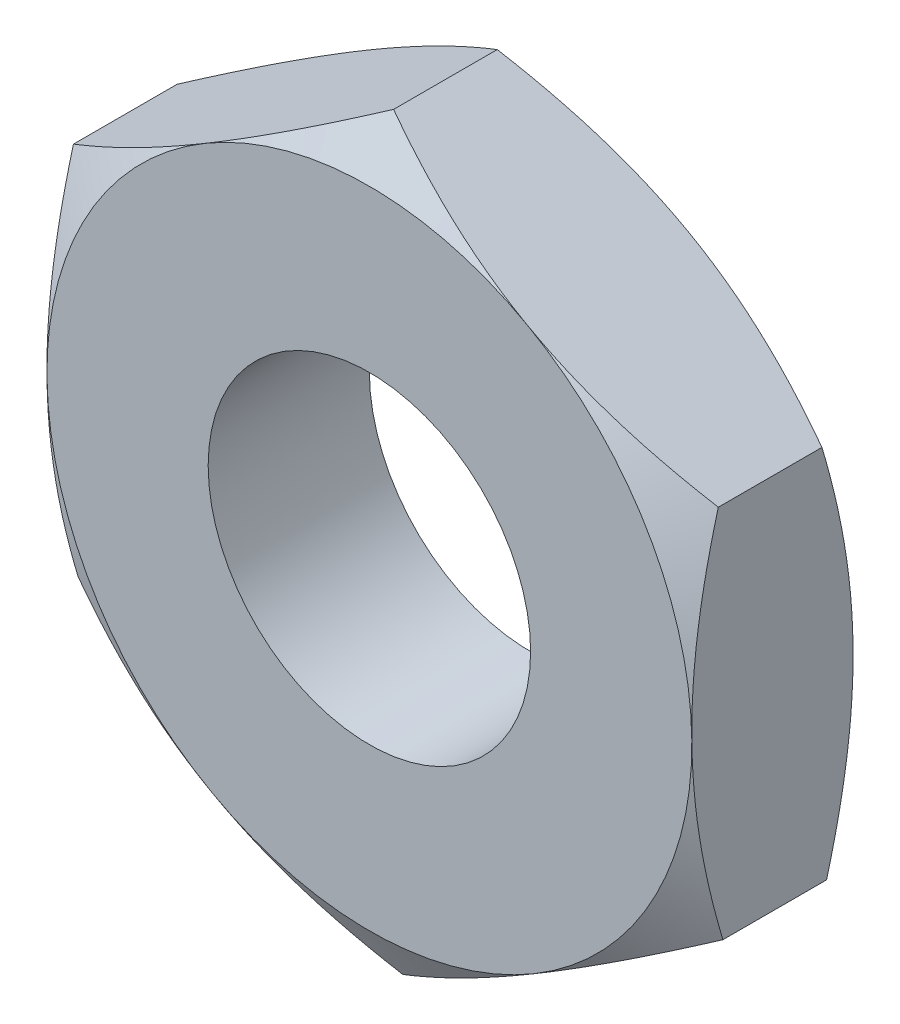
ISO-10303-21;
HEADER;
FILE_DESCRIPTION(('STEP AP214'),'2;1');
FILE_NAME('part.step','',(''),(''),'','','');
FILE_SCHEMA(('AUTOMOTIVE_DESIGN { 1 0 10303 214 1 1 1 1 }'));
ENDSEC;
DATA;
#1=APPLICATION_CONTEXT('core data for automotive mechanical design processes');
#2=APPLICATION_PROTOCOL_DEFINITION('international standard','automotive_design',2000,#1);
#3=PRODUCT_CONTEXT('',#1,'mechanical');
#4=PRODUCT('Part','Part','',(#3));
#5=PRODUCT_RELATED_PRODUCT_CATEGORY('part','',(#4));
#6=PRODUCT_DEFINITION_FORMATION('','',#4);
#7=PRODUCT_DEFINITION_CONTEXT('part definition',#1,'design');
#8=PRODUCT_DEFINITION('design','',#6,#7);
#9=PRODUCT_DEFINITION_SHAPE('','',#8);
#10=(LENGTH_UNIT() NAMED_UNIT(*) SI_UNIT(.MILLI.,.METRE.));
#11=(NAMED_UNIT(*) PLANE_ANGLE_UNIT() SI_UNIT($,.RADIAN.));
#12=(NAMED_UNIT(*) SI_UNIT($,.STERADIAN.) SOLID_ANGLE_UNIT());
#13=UNCERTAINTY_MEASURE_WITH_UNIT(LENGTH_MEASURE(1.E-05),#10,'distance_accuracy_value','');
#14=(GEOMETRIC_REPRESENTATION_CONTEXT(3) GLOBAL_UNCERTAINTY_ASSIGNED_CONTEXT((#13)) GLOBAL_UNIT_ASSIGNED_CONTEXT((#10,
#11,#12)) REPRESENTATION_CONTEXT('',''));
#15=CARTESIAN_POINT('',(0.,0.,0.));
#16=DIRECTION('',(0.,0.,1.));
#17=DIRECTION('',(1.,0.,0.));
#18=AXIS2_PLACEMENT_3D('',#15,#16,#17);
#19=CARTESIAN_POINT('',(0.,0.,-2.5));
#20=DIRECTION('',(0.,0.,1.));
#21=DIRECTION('',(1.,0.,0.));
#22=AXIS2_PLACEMENT_3D('',#19,#20,#21);
#23=PLANE('',#22);
#24=CARTESIAN_POINT('',(0.,0.,-2.5));
#25=DIRECTION('',(0.,0.,1.));
#26=DIRECTION('',(1.,0.,0.));
#27=AXIS2_PLACEMENT_3D('',#24,#25,#26);
#28=CIRCLE('',#27,5.);
#29=CARTESIAN_POINT('',(5.,0.,-2.5));
#30=VERTEX_POINT('',#29);
#31=EDGE_CURVE('E280',#30,#30,#28,.T.);
#32=ORIENTED_EDGE('',*,*,#31,.T.);
#33=EDGE_LOOP('',(#32));
#34=FACE_BOUND('',#33,.T.);
#35=CARTESIAN_POINT('',(0.,0.,-2.5));
#36=DIRECTION('',(0.,0.,1.));
#37=DIRECTION('',(1.,0.,0.));
#38=AXIS2_PLACEMENT_3D('',#35,#36,#37);
#39=CIRCLE('',#38,10.);
#40=CARTESIAN_POINT('',(9.99924389690009,0.122969469000651,-2.5));
#41=VERTEX_POINT('',#40);
#42=CARTESIAN_POINT('',(5.1061166324945,-8.59811449885165,-2.5));
#43=VERTEX_POINT('',#42);
#44=EDGE_CURVE('E50',#41,#43,#39,.F.);
#45=ORIENTED_EDGE('',*,*,#44,.T.);
#46=CARTESIAN_POINT('',(-4.89312726440558,-8.72108396785232,-2.5));
#47=VERTEX_POINT('',#46);
#48=EDGE_CURVE('E12',#43,#47,#39,.F.);
#49=ORIENTED_EDGE('',*,*,#48,.T.);
#50=CARTESIAN_POINT('',(-9.99924389690009,-0.122969469000663,-2.5));
#51=VERTEX_POINT('',#50);
#52=EDGE_CURVE('E56',#47,#51,#39,.F.);
#53=ORIENTED_EDGE('',*,*,#52,.T.);
#54=CARTESIAN_POINT('',(-5.1061166324945,8.59811449885165,-2.5));
#55=VERTEX_POINT('',#54);
#56=EDGE_CURVE('E411',#51,#55,#39,.F.);
#57=ORIENTED_EDGE('',*,*,#56,.T.);
#58=CARTESIAN_POINT('',(4.89312726440559,8.72108396785231,-2.5));
#59=VERTEX_POINT('',#58);
#60=EDGE_CURVE('E156',#55,#59,#39,.F.);
#61=ORIENTED_EDGE('',*,*,#60,.T.);
#62=CARTESIAN_POINT('',(0.,0.,-2.5));
#63=DIRECTION('',(0.,0.,1.));
#64=DIRECTION('',(1.,0.,0.));
#65=AXIS2_PLACEMENT_3D('',#62,#63,#64);
#66=CIRCLE('',#65,10.);
#67=EDGE_CURVE('E138',#41,#59,#66,.T.);
#68=ORIENTED_EDGE('',*,*,#67,.F.);
#69=EDGE_LOOP('',(#45,#49,#53,#57,#61,#68));
#70=FACE_BOUND('',#69,.T.);
#71=ADVANCED_FACE('F45',(#34,#70),#23,.F.);
#72=CARTESIAN_POINT('',(0.,0.,2.5));
#73=DIRECTION('',(0.,0.,1.));
#74=DIRECTION('',(1.,0.,0.));
#75=AXIS2_PLACEMENT_3D('',#72,#73,#74);
#76=PLANE('',#75);
#77=CARTESIAN_POINT('',(0.,0.,2.5));
#78=DIRECTION('',(0.,0.,1.));
#79=DIRECTION('',(1.,0.,0.));
#80=AXIS2_PLACEMENT_3D('',#77,#78,#79);
#81=CIRCLE('',#80,5.);
#82=CARTESIAN_POINT('',(5.,0.,2.5));
#83=VERTEX_POINT('',#82);
#84=EDGE_CURVE('E275',#83,#83,#81,.T.);
#85=ORIENTED_EDGE('',*,*,#84,.F.);
#86=EDGE_LOOP('',(#85));
#87=FACE_BOUND('',#86,.T.);
#88=CARTESIAN_POINT('',(0.,0.,2.5));
#89=DIRECTION('',(0.,0.,1.));
#90=DIRECTION('',(1.,0.,0.));
#91=AXIS2_PLACEMENT_3D('',#88,#89,#90);
#92=CIRCLE('',#91,10.);
#93=CARTESIAN_POINT('',(5.1061166324945,-8.59811449885165,2.5));
#94=VERTEX_POINT('',#93);
#95=CARTESIAN_POINT('',(9.99924389690009,0.122969469000651,2.5));
#96=VERTEX_POINT('',#95);
#97=EDGE_CURVE('E337',#94,#96,#92,.T.);
#98=ORIENTED_EDGE('',*,*,#97,.T.);
#99=CARTESIAN_POINT('',(4.89312726440559,8.72108396785232,2.5));
#100=VERTEX_POINT('',#99);
#101=EDGE_CURVE('E340',#96,#100,#92,.T.);
#102=ORIENTED_EDGE('',*,*,#101,.T.);
#103=CARTESIAN_POINT('',(-5.1061166324945,8.59811449885166,2.5));
#104=VERTEX_POINT('',#103);
#105=EDGE_CURVE('E352',#100,#104,#92,.T.);
#106=ORIENTED_EDGE('',*,*,#105,.T.);
#107=CARTESIAN_POINT('',(-9.9992438969001,-0.122969469000663,2.5));
#108=VERTEX_POINT('',#107);
#109=EDGE_CURVE('E355',#104,#108,#92,.T.);
#110=ORIENTED_EDGE('',*,*,#109,.T.);
#111=CARTESIAN_POINT('',(-4.89312726440558,-8.72108396785232,2.5));
#112=VERTEX_POINT('',#111);
#113=EDGE_CURVE('E350',#108,#112,#92,.T.);
#114=ORIENTED_EDGE('',*,*,#113,.T.);
#115=EDGE_CURVE('E343',#112,#94,#92,.T.);
#116=ORIENTED_EDGE('',*,*,#115,.T.);
#117=EDGE_LOOP('',(#98,#102,#106,#110,#114,#116));
#118=FACE_BOUND('',#117,.T.);
#119=ADVANCED_FACE('F318',(#87,#118),#76,.T.);
#120=CARTESIAN_POINT('',(0.14199291205927,-11.546132311136,2.5));
#121=DIRECTION('',(-0.51061166324945,0.859811449885165,0.));
#122=DIRECTION('',(-0.859811449885165,-0.51061166324945,0.));
#123=AXIS2_PLACEMENT_3D('',#120,#121,#122);
#124=PLANE('',#123);
#125=DIRECTION('',(0.,0.,-1.));
#126=VECTOR('',#125,1.);
#127=CARTESIAN_POINT('',(0.14199291205927,-11.546132311136,2.5));
#128=LINE('',#127,#126);
#129=CARTESIAN_POINT('',(0.141992912059271,-11.546132311136,1.6068360252296));
#130=VERTEX_POINT('',#129);
#131=CARTESIAN_POINT('',(0.14199291205927,-11.546132311136,-1.6068360252296));
#132=VERTEX_POINT('',#131);
#133=EDGE_CURVE('E279',#130,#132,#128,.T.);
#134=ORIENTED_EDGE('',*,*,#133,.T.);
#135=CARTESIAN_POINT('',(0.14179291205927,-11.5462510840747,-1.60676887574095));
#136=CARTESIAN_POINT('',(0.36003742235635,-11.4166433748348,-1.68003086041392));
#137=CARTESIAN_POINT('',(0.579095662103258,-11.2865524204045,-1.74996771347809));
#138=CARTESIAN_POINT('',(1.01896882595015,-11.0253272787288,-1.88226853206774));
#139=CARTESIAN_POINT('',(1.23978430252224,-10.8941927633897,-1.94463000688557));
#140=CARTESIAN_POINT('',(1.9057887366652,-10.4986762441637,-2.1191445193077));
#141=CARTESIAN_POINT('',(2.35360683563148,-10.2327328860275,-2.2184075331083));
#142=CARTESIAN_POINT('',(3.02374611913412,-9.83476082575339,-2.33480262222604));
#143=CARTESIAN_POINT('',(3.24406521952897,-9.70392109070071,-2.36795919843691));
#144=CARTESIAN_POINT('',(3.68572348225829,-9.44163584182411,-2.42356063306236));
#145=CARTESIAN_POINT('',(3.90706266414321,-9.31019031638987,-2.44600528530741));
#146=CARTESIAN_POINT('',(4.35011023453883,-9.04708000674169,-2.47960778554735));
#147=CARTESIAN_POINT('',(4.57181786921312,-8.91541567020458,-2.49077904611686));
#148=CARTESIAN_POINT('',(5.01543792483326,-8.65196538179394,-2.50159738523386));
#149=CARTESIAN_POINT('',(5.23735033924013,-8.52017943380369,-2.5012448198362));
#150=CARTESIAN_POINT('',(5.65222047980425,-8.27380270488914,-2.48981722704964));
#151=CARTESIAN_POINT('',(5.84520748853103,-8.15919453408067,-2.48013622464735));
#152=CARTESIAN_POINT('',(6.23073014979142,-7.9302462369711,-2.45224656286571));
#153=CARTESIAN_POINT('',(6.42326576942857,-7.81590613020604,-2.43403730025691));
#154=CARTESIAN_POINT('',(7.00012659590867,-7.47332885223214,-2.36704763292972));
#155=CARTESIAN_POINT('',(7.3834307196231,-7.24569806624256,-2.30591369487541));
#156=CARTESIAN_POINT('',(8.15410487919466,-6.78802189259453,-2.15307836950258));
#157=CARTESIAN_POINT('',(8.54137656113389,-6.5580349138554,-2.06072913904862));
#158=CARTESIAN_POINT('',(9.3101448030815,-6.10149059739317,-1.85113476781712));
#159=CARTESIAN_POINT('',(9.69165120727897,-5.87492741355373,-1.73393885312451));
#160=CARTESIAN_POINT('',(10.0704403529297,-5.6499779136286,-1.60676887574095));
#161=B_SPLINE_CURVE_WITH_KNOTS('',3,(#135,#136,#137,#138,#139,#140,#141,#142,#143,#144,#145,
#146,#147,#148,#149,#150,#151,#152,#153,#154,#155,#156,#157,#158,#159,#160),.UNSPECIFIED.,.F.,
.F.,(4,2,2,2,2,2,2,2,2,2,2,2,4),(0.,0.792505434166329,1.58527073485053,3.17417612487573,
3.94912807894729,4.72409494770965,5.49813870481568,6.27215854609879,6.94597477369979,
7.61983866954597,8.96852405205878,10.3471199887695,11.7230097658181),.UNSPECIFIED.);
#162=EDGE_CURVE('E65',#132,#43,#161,.T.);
#163=ORIENTED_EDGE('',*,*,#162,.T.);
#164=CARTESIAN_POINT('',(10.0702403529297,-5.65009668656732,-1.6068360252296));
#165=VERTEX_POINT('',#164);
#166=EDGE_CURVE('E153',#43,#165,#161,.T.);
#167=ORIENTED_EDGE('',*,*,#166,.T.);
#168=DIRECTION('',(0.,0.,-1.));
#169=VECTOR('',#168,1.);
#170=CARTESIAN_POINT('',(10.0702403529297,-5.65009668656732,2.5));
#171=LINE('',#170,#169);
#172=CARTESIAN_POINT('',(10.0702403529297,-5.65009668656732,1.6068360252296));
#173=VERTEX_POINT('',#172);
#174=EDGE_CURVE('E167',#173,#165,#171,.T.);
#175=ORIENTED_EDGE('',*,*,#174,.F.);
#176=CARTESIAN_POINT('',(0.14179291205927,-11.5462510840747,1.60676887574095));
#177=CARTESIAN_POINT('',(0.36003742235635,-11.4166433748348,1.68003086041392));
#178=CARTESIAN_POINT('',(0.579095662103258,-11.2865524204045,1.74996771347809));
#179=CARTESIAN_POINT('',(1.01896882595015,-11.0253272787288,1.88226853206774));
#180=CARTESIAN_POINT('',(1.23978430252224,-10.8941927633897,1.94463000688557));
#181=CARTESIAN_POINT('',(1.9057887366652,-10.4986762441637,2.1191445193077));
#182=CARTESIAN_POINT('',(2.35360683563148,-10.2327328860275,2.2184075331083));
#183=CARTESIAN_POINT('',(3.02374611913412,-9.83476082575339,2.33480262222604));
#184=CARTESIAN_POINT('',(3.24406521952897,-9.70392109070071,2.36795919843691));
#185=CARTESIAN_POINT('',(3.68572348225829,-9.44163584182411,2.42356063306236));
#186=CARTESIAN_POINT('',(3.90706266414321,-9.31019031638987,2.44600528530741));
#187=CARTESIAN_POINT('',(4.35011023453883,-9.04708000674169,2.47960778554735));
#188=CARTESIAN_POINT('',(4.57181786921312,-8.91541567020458,2.49077904611686));
#189=CARTESIAN_POINT('',(5.01543792483326,-8.65196538179394,2.50159738523386));
#190=CARTESIAN_POINT('',(5.23735033924013,-8.52017943380369,2.5012448198362));
#191=CARTESIAN_POINT('',(5.65222047980425,-8.27380270488914,2.48981722704964));
#192=CARTESIAN_POINT('',(5.84520748853103,-8.15919453408067,2.48013622464735));
#193=CARTESIAN_POINT('',(6.23073014979142,-7.9302462369711,2.45224656286571));
#194=CARTESIAN_POINT('',(6.42326576942857,-7.81590613020604,2.43403730025691));
#195=CARTESIAN_POINT('',(7.00012659590867,-7.47332885223214,2.36704763292972));
#196=CARTESIAN_POINT('',(7.3834307196231,-7.24569806624256,2.30591369487541));
#197=CARTESIAN_POINT('',(8.15410487919466,-6.78802189259453,2.15307836950258));
#198=CARTESIAN_POINT('',(8.54137656113389,-6.5580349138554,2.06072913904862));
#199=CARTESIAN_POINT('',(9.3101448030815,-6.10149059739317,1.85113476781712));
#200=CARTESIAN_POINT('',(9.69165120727897,-5.87492741355373,1.73393885312451));
#201=CARTESIAN_POINT('',(10.0704403529297,-5.6499779136286,1.60676887574095));
#202=B_SPLINE_CURVE_WITH_KNOTS('',3,(#176,#177,#178,#179,#180,#181,#182,#183,#184,#185,#186,
#187,#188,#189,#190,#191,#192,#193,#194,#195,#196,#197,#198,#199,#200,#201),.UNSPECIFIED.,.F.,
.F.,(4,2,2,2,2,2,2,2,2,2,2,2,4),(0.,0.792505434166329,1.58527073485053,3.17417612487573,
3.94912807894729,4.72409494770965,5.49813870481568,6.27215854609879,6.94597477369979,
7.61983866954597,8.96852405205878,10.3471199887695,11.7230097658181),.UNSPECIFIED.);
#203=EDGE_CURVE('E267',#94,#173,#202,.T.);
#204=ORIENTED_EDGE('',*,*,#203,.F.);
#205=EDGE_CURVE('E274',#130,#94,#202,.T.);
#206=ORIENTED_EDGE('',*,*,#205,.F.);
#207=EDGE_LOOP('',(#134,#163,#167,#175,#204,#206));
#208=FACE_BOUND('',#207,.T.);
#209=ADVANCED_FACE('F47',(#208),#124,.F.);
#210=CARTESIAN_POINT('',(10.0702403529297,-5.65009668656732,2.5));
#211=DIRECTION('',(-0.999924389690009,-0.0122969469000651,0.));
#212=DIRECTION('',(0.0122969469000651,-0.999924389690009,0.));
#213=AXIS2_PLACEMENT_3D('',#210,#211,#212);
#214=PLANE('',#213);
#215=ORIENTED_EDGE('',*,*,#174,.T.);
#216=CARTESIAN_POINT('',(10.0702428125051,-5.65029668656732,-1.60677828508688));
#217=CARTESIAN_POINT('',(10.0671215023005,-5.39648781623019,-1.68003988044595));
#218=CARTESIAN_POINT('',(10.0639885542263,-5.14173261426885,-1.74997633478115));
#219=CARTESIAN_POINT('',(10.0576975342042,-4.63017926633226,-1.88227633864652));
#220=CARTESIAN_POINT('',(10.054539454355,-4.37338047785744,-1.94463739746486));
#221=CARTESIAN_POINT('',(10.0450143289407,-3.5988463358519,-2.11915063279933));
#222=CARTESIAN_POINT('',(10.0386096817883,-3.07805341488414,-2.21841276348158));
#223=CARTESIAN_POINT('',(10.0290254206112,-2.29871065719994,-2.33480653670247));
#224=CARTESIAN_POINT('',(10.0258744399154,-2.04248913532384,-2.3679626825303));
#225=CARTESIAN_POINT('',(10.0195578898967,-1.52885981955494,-2.42356326046315));
#226=CARTESIAN_POINT('',(10.0163923202943,-1.27145200292559,-2.44600748639389));
#227=CARTESIAN_POINT('',(10.0100559009095,-0.756207012635103,-2.47960914908463));
#228=CARTESIAN_POINT('',(10.0068850619081,-0.498370715621675,-2.49077999824805));
#229=CARTESIAN_POINT('',(10.0005404552955,0.0175400178689814,-2.50159753944489));
#230=CARTESIAN_POINT('',(9.99736668777788,0.275614446741925,-2.5012445875456));
#231=CARTESIAN_POINT('',(9.99143328578816,0.758088138103552,-2.48981635482344));
#232=CARTESIAN_POINT('',(9.98867323246986,0.982521459011738,-2.48013517690069));
#233=CARTESIAN_POINT('',(9.98315958105473,1.43086319546391,-2.45224535408926));
#234=CARTESIAN_POINT('',(9.98040598342837,1.65477157275219,-2.43403610600387));
#235=CARTESIAN_POINT('',(9.97215586019002,2.3256291043829,-2.36704675861896));
#236=CARTESIAN_POINT('',(9.96667393778755,2.77139080093826,-2.30591340243068));
#237=CARTESIAN_POINT('',(9.95565194433535,3.66764254256348,-2.15307989470008));
#238=CARTESIAN_POINT('',(9.95011327988148,4.11801821050275,-2.06073192342783));
#239=CARTESIAN_POINT('',(9.93911854419434,5.01205349105785,-1.85114054896142));
#240=CARTESIAN_POINT('',(9.9336623321776,5.45572455145938,-1.73394636947613));
#241=CARTESIAN_POINT('',(9.92824498129511,5.89623562456866,-1.60677828508687));
#242=B_SPLINE_CURVE_WITH_KNOTS('',3,(#216,#217,#218,#219,#220,#221,#222,#223,#224,#225,#226,
#227,#228,#229,#230,#231,#232,#233,#234,#235,#236,#237,#238,#239,#240,#241),.UNSPECIFIED.,.F.,
.F.,(4,2,2,2,2,2,2,2,2,2,2,2,4),(0.,0.792504319030487,1.58526850406512,3.17417160126665,
3.94912254597345,4.72408840570207,5.49813116559009,6.2721500088,6.94595902128464,
7.61981569997931,8.96848660401378,10.3470672962155,11.7229419368444),.UNSPECIFIED.);
#243=EDGE_CURVE('E147',#165,#41,#242,.T.);
#244=ORIENTED_EDGE('',*,*,#243,.T.);
#245=CARTESIAN_POINT('',(9.92824744087046,5.89603562456866,-1.60683602522959));
#246=VERTEX_POINT('',#245);
#247=EDGE_CURVE('E134',#41,#246,#242,.T.);
#248=ORIENTED_EDGE('',*,*,#247,.T.);
#249=DIRECTION('',(0.,0.,-1.));
#250=VECTOR('',#249,1.);
#251=CARTESIAN_POINT('',(9.92824744087046,5.89603562456866,2.5));
#252=LINE('',#251,#250);
#253=CARTESIAN_POINT('',(9.92824744087046,5.89603562456866,1.60683602522959));
#254=VERTEX_POINT('',#253);
#255=EDGE_CURVE('E299',#254,#246,#252,.T.);
#256=ORIENTED_EDGE('',*,*,#255,.F.);
#257=CARTESIAN_POINT('',(10.0702428125051,-5.65029668656732,1.60677828508688));
#258=CARTESIAN_POINT('',(10.0671215023005,-5.39648781623019,1.68003988044595));
#259=CARTESIAN_POINT('',(10.0639885542263,-5.14173261426885,1.74997633478115));
#260=CARTESIAN_POINT('',(10.0576975342042,-4.63017926633226,1.88227633864652));
#261=CARTESIAN_POINT('',(10.054539454355,-4.37338047785744,1.94463739746486));
#262=CARTESIAN_POINT('',(10.0450143289407,-3.5988463358519,2.11915063279933));
#263=CARTESIAN_POINT('',(10.0386096817883,-3.07805341488414,2.21841276348158));
#264=CARTESIAN_POINT('',(10.0290254206112,-2.29871065719994,2.33480653670247));
#265=CARTESIAN_POINT('',(10.0258744399154,-2.04248913532384,2.3679626825303));
#266=CARTESIAN_POINT('',(10.0195578898967,-1.52885981955494,2.42356326046315));
#267=CARTESIAN_POINT('',(10.0163923202943,-1.27145200292559,2.44600748639389));
#268=CARTESIAN_POINT('',(10.0100559009095,-0.756207012635103,2.47960914908463));
#269=CARTESIAN_POINT('',(10.0068850619081,-0.498370715621675,2.49077999824805));
#270=CARTESIAN_POINT('',(10.0005404552955,0.0175400178689814,2.50159753944489));
#271=CARTESIAN_POINT('',(9.99736668777788,0.275614446741925,2.5012445875456));
#272=CARTESIAN_POINT('',(9.99143328578816,0.758088138103552,2.48981635482344));
#273=CARTESIAN_POINT('',(9.98867323246986,0.982521459011738,2.48013517690069));
#274=CARTESIAN_POINT('',(9.98315958105473,1.43086319546391,2.45224535408926));
#275=CARTESIAN_POINT('',(9.98040598342837,1.65477157275219,2.43403610600387));
#276=CARTESIAN_POINT('',(9.97215586019002,2.3256291043829,2.36704675861896));
#277=CARTESIAN_POINT('',(9.96667393778755,2.77139080093826,2.30591340243068));
#278=CARTESIAN_POINT('',(9.95565194433535,3.66764254256348,2.15307989470008));
#279=CARTESIAN_POINT('',(9.95011327988148,4.11801821050275,2.06073192342783));
#280=CARTESIAN_POINT('',(9.93911854419434,5.01205349105785,1.85114054896142));
#281=CARTESIAN_POINT('',(9.9336623321776,5.45572455145938,1.73394636947613));
#282=CARTESIAN_POINT('',(9.92824498129511,5.89623562456866,1.60677828508687));
#283=B_SPLINE_CURVE_WITH_KNOTS('',3,(#257,#258,#259,#260,#261,#262,#263,#264,#265,#266,#267,
#268,#269,#270,#271,#272,#273,#274,#275,#276,#277,#278,#279,#280,#281,#282),.UNSPECIFIED.,.F.,
.F.,(4,2,2,2,2,2,2,2,2,2,2,2,4),(0.,0.792504319030487,1.58526850406512,3.17417160126665,
3.94912254597345,4.72408840570207,5.49813116559009,6.2721500088,6.94595902128464,
7.61981569997931,8.96848660401378,10.3470672962155,11.7229419368444),.UNSPECIFIED.);
#284=EDGE_CURVE('E259',#96,#254,#283,.T.);
#285=ORIENTED_EDGE('',*,*,#284,.F.);
#286=EDGE_CURVE('E266',#173,#96,#283,.T.);
#287=ORIENTED_EDGE('',*,*,#286,.F.);
#288=EDGE_LOOP('',(#215,#244,#248,#256,#285,#287));
#289=FACE_BOUND('',#288,.T.);
#290=ADVANCED_FACE('F164',(#289),#214,.F.);
#291=CARTESIAN_POINT('',(9.92824744087046,5.89603562456866,2.5));
#292=DIRECTION('',(-0.489312726440559,-0.872108396785231,0.));
#293=DIRECTION('',(0.872108396785231,-0.489312726440559,0.));
#294=AXIS2_PLACEMENT_3D('',#291,#292,#293);
#295=PLANE('',#294);
#296=ORIENTED_EDGE('',*,*,#255,.T.);
#297=CARTESIAN_POINT('',(9.92844744087046,5.8959234108282,-1.60676982257966));
#298=CARTESIAN_POINT('',(9.70708164107971,6.0201248328482,-1.68003176807704));
#299=CARTESIAN_POINT('',(9.48489047407105,6.14478934258206,-1.74996858101821));
#300=CARTESIAN_POINT('',(9.03872633225487,6.39511807863922,-1.8822693176244));
#301=CARTESIAN_POINT('',(8.81475279707401,6.52078261937047,-1.94463075058134));
#302=CARTESIAN_POINT('',(8.13922330367167,6.89980107559239,-2.11914513449364));
#303=CARTESIAN_POINT('',(7.68500060344277,7.1546512165605,-2.21840805942844));
#304=CARTESIAN_POINT('',(7.00527712789358,7.53602278490298,-2.33480301613106));
#305=CARTESIAN_POINT('',(6.78180706820011,7.66140484129588,-2.36795954903365));
#306=CARTESIAN_POINT('',(6.33383229952356,7.91274946341592,-2.42356089745244));
#307=CARTESIAN_POINT('',(6.1093275707104,8.0387120402691,-2.44600550679863));
#308=CARTESIAN_POINT('',(5.65994362738594,8.29084730618015,-2.47960792275823));
#309=CARTESIAN_POINT('',(5.43506517748952,8.41701956623654,-2.49077914192905));
#310=CARTESIAN_POINT('',(4.98510056419774,8.66948062789261,-2.50159740075345));
#311=CARTESIAN_POINT('',(4.76001440743486,8.79576942577102,-2.50124479646315));
#312=CARTESIAN_POINT('',(4.33921107272339,9.03186900669691,-2.48981713928127));
#313=CARTESIAN_POINT('',(4.14346419305503,9.14169645444977,-2.48013611921656));
#314=CARTESIAN_POINT('',(3.75242824492024,9.36109448641852,-2.45224644123048));
#315=CARTESIAN_POINT('',(3.55713920982061,9.47066505191335,-2.43403718008296));
#316=CARTESIAN_POINT('',(2.97202880629469,9.79895218671606,-2.36704754495029));
#317=CARTESIAN_POINT('',(2.58324312279132,10.0170876656282,-2.3059136654475));
#318=CARTESIAN_POINT('',(1.80154770522235,10.4556724991498,-2.15307852297922));
#319=CARTESIAN_POINT('',(1.40873773134445,10.67606588144,-2.06072941923355));
#320=CARTESIAN_POINT('',(0.628975486100327,11.1135660724739,-1.851135349559));
#321=CARTESIAN_POINT('',(0.242013229806111,11.3306784834482,-1.73393960947598));
#322=CARTESIAN_POINT('',(-0.142192912059268,11.5462445248764,-1.60676982257966));
#323=B_SPLINE_CURVE_WITH_KNOTS('',3,(#297,#298,#299,#300,#301,#302,#303,#304,#305,#306,#307,
#308,#309,#310,#311,#312,#313,#314,#315,#316,#317,#318,#319,#320,#321,#322),.UNSPECIFIED.,.F.,
.F.,(4,2,2,2,2,2,2,2,2,2,2,2,4),(0.,0.792505321953039,1.58527051037226,3.17417566967643,
3.94912752217816,4.724094289404,5.49813794616251,6.27215768701203,6.94597318857569,
7.61983635817972,8.96852028376295,10.34711468646,11.7230029403718),.UNSPECIFIED.);
#324=EDGE_CURVE('E141',#246,#59,#323,.T.);
#325=ORIENTED_EDGE('',*,*,#324,.T.);
#326=CARTESIAN_POINT('',(-0.14199291205927,11.546132311136,-1.60683602522959));
#327=VERTEX_POINT('',#326);
#328=EDGE_CURVE('E177',#59,#327,#323,.T.);
#329=ORIENTED_EDGE('',*,*,#328,.T.);
#330=DIRECTION('',(0.,0.,-1.));
#331=VECTOR('',#330,1.);
#332=CARTESIAN_POINT('',(-0.14199291205927,11.546132311136,2.5));
#333=LINE('',#332,#331);
#334=CARTESIAN_POINT('',(-0.14199291205927,11.546132311136,1.60683602522959));
#335=VERTEX_POINT('',#334);
#336=EDGE_CURVE('E295',#335,#327,#333,.T.);
#337=ORIENTED_EDGE('',*,*,#336,.F.);
#338=CARTESIAN_POINT('',(9.92844744087046,5.8959234108282,1.60676982257966));
#339=CARTESIAN_POINT('',(9.70708164107971,6.0201248328482,1.68003176807704));
#340=CARTESIAN_POINT('',(9.48489047407105,6.14478934258206,1.74996858101821));
#341=CARTESIAN_POINT('',(9.03872633225487,6.39511807863922,1.8822693176244));
#342=CARTESIAN_POINT('',(8.81475279707401,6.52078261937047,1.94463075058134));
#343=CARTESIAN_POINT('',(8.13922330367167,6.89980107559239,2.11914513449364));
#344=CARTESIAN_POINT('',(7.68500060344277,7.1546512165605,2.21840805942844));
#345=CARTESIAN_POINT('',(7.00527712789358,7.53602278490298,2.33480301613106));
#346=CARTESIAN_POINT('',(6.78180706820011,7.66140484129588,2.36795954903365));
#347=CARTESIAN_POINT('',(6.33383229952356,7.91274946341592,2.42356089745244));
#348=CARTESIAN_POINT('',(6.1093275707104,8.0387120402691,2.44600550679863));
#349=CARTESIAN_POINT('',(5.65994362738594,8.29084730618015,2.47960792275823));
#350=CARTESIAN_POINT('',(5.43506517748952,8.41701956623654,2.49077914192905));
#351=CARTESIAN_POINT('',(4.98510056419774,8.66948062789261,2.50159740075345));
#352=CARTESIAN_POINT('',(4.76001440743486,8.79576942577102,2.50124479646315));
#353=CARTESIAN_POINT('',(4.33921107272339,9.03186900669691,2.48981713928127));
#354=CARTESIAN_POINT('',(4.14346419305503,9.14169645444977,2.48013611921656));
#355=CARTESIAN_POINT('',(3.75242824492024,9.36109448641852,2.45224644123048));
#356=CARTESIAN_POINT('',(3.55713920982061,9.47066505191335,2.43403718008296));
#357=CARTESIAN_POINT('',(2.97202880629469,9.79895218671606,2.36704754495029));
#358=CARTESIAN_POINT('',(2.58324312279132,10.0170876656282,2.3059136654475));
#359=CARTESIAN_POINT('',(1.80154770522235,10.4556724991498,2.15307852297922));
#360=CARTESIAN_POINT('',(1.40873773134445,10.67606588144,2.06072941923355));
#361=CARTESIAN_POINT('',(0.628975486100327,11.1135660724739,1.851135349559));
#362=CARTESIAN_POINT('',(0.242013229806111,11.3306784834482,1.73393960947598));
#363=CARTESIAN_POINT('',(-0.142192912059268,11.5462445248764,1.60676982257966));
#364=B_SPLINE_CURVE_WITH_KNOTS('',3,(#338,#339,#340,#341,#342,#343,#344,#345,#346,#347,#348,
#349,#350,#351,#352,#353,#354,#355,#356,#357,#358,#359,#360,#361,#362,#363),.UNSPECIFIED.,.F.,
.F.,(4,2,2,2,2,2,2,2,2,2,2,2,4),(0.,0.792505321953039,1.58527051037226,3.17417566967643,
3.94912752217816,4.724094289404,5.49813794616251,6.27215768701203,6.94597318857569,
7.61983635817972,8.96852028376295,10.34711468646,11.7230029403718),.UNSPECIFIED.);
#365=EDGE_CURVE('E251',#100,#335,#364,.T.);
#366=ORIENTED_EDGE('',*,*,#365,.F.);
#367=EDGE_CURVE('E258',#254,#100,#364,.T.);
#368=ORIENTED_EDGE('',*,*,#367,.F.);
#369=EDGE_LOOP('',(#296,#325,#329,#337,#366,#368));
#370=FACE_BOUND('',#369,.T.);
#371=ADVANCED_FACE('F230',(#370),#295,.F.);
#372=CARTESIAN_POINT('',(-0.14199291205927,11.546132311136,2.5));
#373=DIRECTION('',(0.51061166324945,-0.859811449885165,0.));
#374=DIRECTION('',(0.859811449885165,0.51061166324945,0.));
#375=AXIS2_PLACEMENT_3D('',#372,#373,#374);
#376=PLANE('',#375);
#377=ORIENTED_EDGE('',*,*,#336,.T.);
#378=CARTESIAN_POINT('',(-0.14179291205927,11.5462510840747,-1.60676887574094));
#379=CARTESIAN_POINT('',(-0.360037422356351,11.4166433748348,-1.68003086041391));
#380=CARTESIAN_POINT('',(-0.579095662103259,11.2865524204045,-1.74996771347808));
#381=CARTESIAN_POINT('',(-1.01896882595015,11.0253272787288,-1.88226853206773));
#382=CARTESIAN_POINT('',(-1.23978430252225,10.8941927633897,-1.94463000688557));
#383=CARTESIAN_POINT('',(-1.90578873666521,10.4986762441637,-2.1191445193077));
#384=CARTESIAN_POINT('',(-2.35360683563149,10.2327328860275,-2.21840753310829));
#385=CARTESIAN_POINT('',(-3.02374611913412,9.8347608257534,-2.33480262222603));
#386=CARTESIAN_POINT('',(-3.24406521952898,9.70392109070072,-2.3679591984369));
#387=CARTESIAN_POINT('',(-3.6857234822583,9.44163584182412,-2.42356063306235));
#388=CARTESIAN_POINT('',(-3.90706266414322,9.31019031638988,-2.4460052853074));
#389=CARTESIAN_POINT('',(-4.35011023453884,9.0470800067417,-2.47960778554734));
#390=CARTESIAN_POINT('',(-4.57181786921313,8.91541567020459,-2.49077904611685));
#391=CARTESIAN_POINT('',(-5.01543792483327,8.65196538179396,-2.50159738523385));
#392=CARTESIAN_POINT('',(-5.23735033924014,8.5201794338037,-2.50124481983619));
#393=CARTESIAN_POINT('',(-5.65222047980426,8.27380270488916,-2.48981722704963));
#394=CARTESIAN_POINT('',(-5.84520748853104,8.15919453408068,-2.48013622464734));
#395=CARTESIAN_POINT('',(-6.23073014979142,7.93024623697112,-2.4522465628657));
#396=CARTESIAN_POINT('',(-6.42326576942859,7.81590613020605,-2.43403730025691));
#397=CARTESIAN_POINT('',(-7.00012659590868,7.47332885223215,-2.36704763292971));
#398=CARTESIAN_POINT('',(-7.38343071962311,7.24569806624257,-2.3059136948754));
#399=CARTESIAN_POINT('',(-8.15410487919467,6.78802189259454,-2.15307836950257));
#400=CARTESIAN_POINT('',(-8.5413765611339,6.55803491385541,-2.06072913904861));
#401=CARTESIAN_POINT('',(-9.31014480308151,6.10149059739318,-1.85113476781711));
#402=CARTESIAN_POINT('',(-9.69165120727898,5.87492741355374,-1.7339388531245));
#403=CARTESIAN_POINT('',(-10.0704403529297,5.64997791362861,-1.60676887574094));
#404=B_SPLINE_CURVE_WITH_KNOTS('',3,(#378,#379,#380,#381,#382,#383,#384,#385,#386,#387,#388,
#389,#390,#391,#392,#393,#394,#395,#396,#397,#398,#399,#400,#401,#402,#403),.UNSPECIFIED.,.F.,
.F.,(4,2,2,2,2,2,2,2,2,2,2,2,4),(0.,0.792505434166332,1.58527073485054,3.17417612487574,
3.94912807894729,4.72409494770965,5.49813870481569,6.2721585460988,6.94597477369981,
7.61983866954598,8.96852405205879,10.3471199887695,11.7230097658181),.UNSPECIFIED.);
#405=EDGE_CURVE('E224',#327,#55,#404,.T.);
#406=ORIENTED_EDGE('',*,*,#405,.T.);
#407=CARTESIAN_POINT('',(-10.0702403529297,5.65009668656733,-1.60683602522959));
#408=VERTEX_POINT('',#407);
#409=EDGE_CURVE('E216',#55,#408,#404,.T.);
#410=ORIENTED_EDGE('',*,*,#409,.T.);
#411=DIRECTION('',(0.,0.,-1.));
#412=VECTOR('',#411,1.);
#413=CARTESIAN_POINT('',(-10.0702403529297,5.65009668656733,2.5));
#414=LINE('',#413,#412);
#415=CARTESIAN_POINT('',(-10.0702403529297,5.65009668656733,1.60683602522959));
#416=VERTEX_POINT('',#415);
#417=EDGE_CURVE('E291',#416,#408,#414,.T.);
#418=ORIENTED_EDGE('',*,*,#417,.F.);
#419=CARTESIAN_POINT('',(-0.14179291205927,11.5462510840747,1.60676887574094));
#420=CARTESIAN_POINT('',(-0.360037422356351,11.4166433748348,1.68003086041391));
#421=CARTESIAN_POINT('',(-0.579095662103259,11.2865524204045,1.74996771347808));
#422=CARTESIAN_POINT('',(-1.01896882595015,11.0253272787288,1.88226853206773));
#423=CARTESIAN_POINT('',(-1.23978430252225,10.8941927633897,1.94463000688557));
#424=CARTESIAN_POINT('',(-1.90578873666521,10.4986762441637,2.1191445193077));
#425=CARTESIAN_POINT('',(-2.35360683563149,10.2327328860275,2.21840753310829));
#426=CARTESIAN_POINT('',(-3.02374611913412,9.8347608257534,2.33480262222603));
#427=CARTESIAN_POINT('',(-3.24406521952898,9.70392109070072,2.3679591984369));
#428=CARTESIAN_POINT('',(-3.6857234822583,9.44163584182412,2.42356063306235));
#429=CARTESIAN_POINT('',(-3.90706266414322,9.31019031638988,2.4460052853074));
#430=CARTESIAN_POINT('',(-4.35011023453884,9.0470800067417,2.47960778554734));
#431=CARTESIAN_POINT('',(-4.57181786921313,8.91541567020459,2.49077904611685));
#432=CARTESIAN_POINT('',(-5.01543792483327,8.65196538179396,2.50159738523385));
#433=CARTESIAN_POINT('',(-5.23735033924014,8.5201794338037,2.50124481983619));
#434=CARTESIAN_POINT('',(-5.65222047980426,8.27380270488916,2.48981722704963));
#435=CARTESIAN_POINT('',(-5.84520748853104,8.15919453408068,2.48013622464734));
#436=CARTESIAN_POINT('',(-6.23073014979142,7.93024623697112,2.4522465628657));
#437=CARTESIAN_POINT('',(-6.42326576942859,7.81590613020605,2.43403730025691));
#438=CARTESIAN_POINT('',(-7.00012659590868,7.47332885223215,2.36704763292971));
#439=CARTESIAN_POINT('',(-7.38343071962311,7.24569806624257,2.3059136948754));
#440=CARTESIAN_POINT('',(-8.15410487919467,6.78802189259454,2.15307836950257));
#441=CARTESIAN_POINT('',(-8.5413765611339,6.55803491385541,2.06072913904861));
#442=CARTESIAN_POINT('',(-9.31014480308151,6.10149059739318,1.85113476781711));
#443=CARTESIAN_POINT('',(-9.69165120727898,5.87492741355374,1.7339388531245));
#444=CARTESIAN_POINT('',(-10.0704403529297,5.64997791362861,1.60676887574094));
#445=B_SPLINE_CURVE_WITH_KNOTS('',3,(#419,#420,#421,#422,#423,#424,#425,#426,#427,#428,#429,
#430,#431,#432,#433,#434,#435,#436,#437,#438,#439,#440,#441,#442,#443,#444),.UNSPECIFIED.,.F.,
.F.,(4,2,2,2,2,2,2,2,2,2,2,2,4),(0.,0.792505434166332,1.58527073485054,3.17417612487574,
3.94912807894729,4.72409494770965,5.49813870481569,6.2721585460988,6.94597477369981,
7.61983866954598,8.96852405205879,10.3471199887695,11.7230097658181),.UNSPECIFIED.);
#446=EDGE_CURVE('E236',#104,#416,#445,.T.);
#447=ORIENTED_EDGE('',*,*,#446,.F.);
#448=EDGE_CURVE('E244',#335,#104,#445,.T.);
#449=ORIENTED_EDGE('',*,*,#448,.F.);
#450=EDGE_LOOP('',(#377,#406,#410,#418,#447,#449));
#451=FACE_BOUND('',#450,.T.);
#452=ADVANCED_FACE('F226',(#451),#376,.F.);
#453=CARTESIAN_POINT('',(-10.0702403529297,5.65009668656733,2.5));
#454=DIRECTION('',(0.999924389690009,0.0122969469000663,0.));
#455=DIRECTION('',(-0.0122969469000663,0.999924389690009,0.));
#456=AXIS2_PLACEMENT_3D('',#453,#454,#455);
#457=PLANE('',#456);
#458=ORIENTED_EDGE('',*,*,#417,.T.);
#459=CARTESIAN_POINT('',(-10.0702428125051,5.65029668656733,-1.60677828508687));
#460=CARTESIAN_POINT('',(-10.0671215023005,5.3964878162302,-1.68003988044594));
#461=CARTESIAN_POINT('',(-10.0639885542263,5.14173261426886,-1.74997633478115));
#462=CARTESIAN_POINT('',(-10.0576975342042,4.63017926633226,-1.88227633864652));
#463=CARTESIAN_POINT('',(-10.054539454355,4.37338047785745,-1.94463739746485));
#464=CARTESIAN_POINT('',(-10.0450143289407,3.5988463358519,-2.11915063279932));
#465=CARTESIAN_POINT('',(-10.0386096817883,3.07805341488414,-2.21841276348157));
#466=CARTESIAN_POINT('',(-10.0290254206112,2.29871065719995,-2.33480653670246));
#467=CARTESIAN_POINT('',(-10.0258744399154,2.04248913532384,-2.36796268253029));
#468=CARTESIAN_POINT('',(-10.0195578898967,1.52885981955494,-2.42356326046314));
#469=CARTESIAN_POINT('',(-10.0163923202943,1.27145200292559,-2.44600748639388));
#470=CARTESIAN_POINT('',(-10.0100559009095,0.756207012635106,-2.47960914908462));
#471=CARTESIAN_POINT('',(-10.0068850619081,0.498370715621678,-2.49077999824804));
#472=CARTESIAN_POINT('',(-10.0005404552955,-0.0175400178689797,-2.50159753944489));
#473=CARTESIAN_POINT('',(-9.99736668777789,-0.275614446741923,-2.5012445875456));
#474=CARTESIAN_POINT('',(-9.99143328578817,-0.758088138103551,-2.48981635482344));
#475=CARTESIAN_POINT('',(-9.98867323246987,-0.982521459011737,-2.48013517690068));
#476=CARTESIAN_POINT('',(-9.98315958105474,-1.4308631954639,-2.45224535408926));
#477=CARTESIAN_POINT('',(-9.98040598342837,-1.65477157275219,-2.43403610600387));
#478=CARTESIAN_POINT('',(-9.97215586019003,-2.3256291043829,-2.36704675861896));
#479=CARTESIAN_POINT('',(-9.96667393778755,-2.77139080093826,-2.30591340243068));
#480=CARTESIAN_POINT('',(-9.95565194433535,-3.66764254256347,-2.15307989470008));
#481=CARTESIAN_POINT('',(-9.95011327988149,-4.11801821050275,-2.06073192342783));
#482=CARTESIAN_POINT('',(-9.93911854419434,-5.01205349105785,-1.85114054896142));
#483=CARTESIAN_POINT('',(-9.9336623321776,-5.45572455145937,-1.73394636947613));
#484=CARTESIAN_POINT('',(-9.92824498129511,-5.89623562456865,-1.60677828508687));
#485=B_SPLINE_CURVE_WITH_KNOTS('',3,(#459,#460,#461,#462,#463,#464,#465,#466,#467,#468,#469,
#470,#471,#472,#473,#474,#475,#476,#477,#478,#479,#480,#481,#482,#483,#484),.UNSPECIFIED.,.F.,
.F.,(4,2,2,2,2,2,2,2,2,2,2,2,4),(0.,0.792504319030489,1.58526850406512,3.17417160126666,
3.94912254597346,4.72408840570207,5.4981311655901,6.27215000880001,6.94595902128465,
7.61981569997932,8.96848660401379,10.3470672962155,11.7229419368444),.UNSPECIFIED.);
#486=EDGE_CURVE('E225',#408,#51,#485,.T.);
#487=ORIENTED_EDGE('',*,*,#486,.T.);
#488=CARTESIAN_POINT('',(-9.92824744087046,-5.89603562456865,-1.60683602522959));
#489=VERTEX_POINT('',#488);
#490=EDGE_CURVE('E210',#51,#489,#485,.T.);
#491=ORIENTED_EDGE('',*,*,#490,.T.);
#492=DIRECTION('',(0.,0.,-1.));
#493=VECTOR('',#492,1.);
#494=CARTESIAN_POINT('',(-9.92824744087046,-5.89603562456865,2.5));
#495=LINE('',#494,#493);
#496=CARTESIAN_POINT('',(-9.92824744087046,-5.89603562456865,1.60683602522959));
#497=VERTEX_POINT('',#496);
#498=EDGE_CURVE('E287',#497,#489,#495,.T.);
#499=ORIENTED_EDGE('',*,*,#498,.F.);
#500=CARTESIAN_POINT('',(-10.0702428125051,5.65029668656733,1.60677828508687));
#501=CARTESIAN_POINT('',(-10.0671215023005,5.3964878162302,1.68003988044594));
#502=CARTESIAN_POINT('',(-10.0639885542263,5.14173261426886,1.74997633478115));
#503=CARTESIAN_POINT('',(-10.0576975342042,4.63017926633226,1.88227633864652));
#504=CARTESIAN_POINT('',(-10.054539454355,4.37338047785745,1.94463739746485));
#505=CARTESIAN_POINT('',(-10.0450143289407,3.5988463358519,2.11915063279932));
#506=CARTESIAN_POINT('',(-10.0386096817883,3.07805341488414,2.21841276348157));
#507=CARTESIAN_POINT('',(-10.0290254206112,2.29871065719995,2.33480653670246));
#508=CARTESIAN_POINT('',(-10.0258744399154,2.04248913532384,2.36796268253029));
#509=CARTESIAN_POINT('',(-10.0195578898967,1.52885981955494,2.42356326046314));
#510=CARTESIAN_POINT('',(-10.0163923202943,1.27145200292559,2.44600748639388));
#511=CARTESIAN_POINT('',(-10.0100559009095,0.756207012635106,2.47960914908462));
#512=CARTESIAN_POINT('',(-10.0068850619081,0.498370715621678,2.49077999824804));
#513=CARTESIAN_POINT('',(-10.0005404552955,-0.0175400178689797,2.50159753944489));
#514=CARTESIAN_POINT('',(-9.99736668777789,-0.275614446741923,2.5012445875456));
#515=CARTESIAN_POINT('',(-9.99143328578817,-0.758088138103551,2.48981635482344));
#516=CARTESIAN_POINT('',(-9.98867323246987,-0.982521459011737,2.48013517690068));
#517=CARTESIAN_POINT('',(-9.98315958105474,-1.4308631954639,2.45224535408926));
#518=CARTESIAN_POINT('',(-9.98040598342837,-1.65477157275219,2.43403610600387));
#519=CARTESIAN_POINT('',(-9.97215586019003,-2.3256291043829,2.36704675861896));
#520=CARTESIAN_POINT('',(-9.96667393778755,-2.77139080093826,2.30591340243068));
#521=CARTESIAN_POINT('',(-9.95565194433535,-3.66764254256347,2.15307989470008));
#522=CARTESIAN_POINT('',(-9.95011327988149,-4.11801821050275,2.06073192342783));
#523=CARTESIAN_POINT('',(-9.93911854419434,-5.01205349105785,1.85114054896142));
#524=CARTESIAN_POINT('',(-9.9336623321776,-5.45572455145937,1.73394636947613));
#525=CARTESIAN_POINT('',(-9.92824498129511,-5.89623562456865,1.60677828508687));
#526=B_SPLINE_CURVE_WITH_KNOTS('',3,(#500,#501,#502,#503,#504,#505,#506,#507,#508,#509,#510,
#511,#512,#513,#514,#515,#516,#517,#518,#519,#520,#521,#522,#523,#524,#525),.UNSPECIFIED.,.F.,
.F.,(4,2,2,2,2,2,2,2,2,2,2,2,4),(0.,0.792504319030489,1.58526850406512,3.17417160126666,
3.94912254597346,4.72408840570207,5.4981311655901,6.27215000880001,6.94595902128465,
7.61981569997932,8.96848660401379,10.3470672962155,11.7229419368444),.UNSPECIFIED.);
#527=EDGE_CURVE('E246',#108,#497,#526,.T.);
#528=ORIENTED_EDGE('',*,*,#527,.F.);
#529=EDGE_CURVE('E245',#416,#108,#526,.T.);
#530=ORIENTED_EDGE('',*,*,#529,.F.);
#531=EDGE_LOOP('',(#458,#487,#491,#499,#528,#530));
#532=FACE_BOUND('',#531,.T.);
#533=ADVANCED_FACE('F229',(#532),#457,.F.);
#534=CARTESIAN_POINT('',(-9.92824744087046,-5.89603562456865,2.5));
#535=DIRECTION('',(0.489312726440558,0.872108396785232,0.));
#536=DIRECTION('',(-0.872108396785232,0.489312726440558,0.));
#537=AXIS2_PLACEMENT_3D('',#534,#535,#536);
#538=PLANE('',#537);
#539=ORIENTED_EDGE('',*,*,#498,.T.);
#540=CARTESIAN_POINT('',(-9.92844744087046,-5.89592341082819,-1.60676982257966));
#541=CARTESIAN_POINT('',(-9.70708164107971,-6.02012483284819,-1.68003176807704));
#542=CARTESIAN_POINT('',(-9.48489047407105,-6.14478934258205,-1.74996858101822));
#543=CARTESIAN_POINT('',(-9.03872633225487,-6.39511807863922,-1.8822693176244));
#544=CARTESIAN_POINT('',(-8.81475279707401,-6.52078261937046,-1.94463075058135));
#545=CARTESIAN_POINT('',(-8.13922330367167,-6.89980107559238,-2.11914513449364));
#546=CARTESIAN_POINT('',(-7.68500060344277,-7.15465121656049,-2.21840805942845));
#547=CARTESIAN_POINT('',(-7.00527712789357,-7.53602278490297,-2.33480301613106));
#548=CARTESIAN_POINT('',(-6.78180706820011,-7.66140484129587,-2.36795954903366));
#549=CARTESIAN_POINT('',(-6.33383229952356,-7.91274946341591,-2.42356089745244));
#550=CARTESIAN_POINT('',(-6.1093275707104,-8.0387120402691,-2.44600550679863));
#551=CARTESIAN_POINT('',(-5.65994362738594,-8.29084730618014,-2.47960792275824));
#552=CARTESIAN_POINT('',(-5.43506517748952,-8.41701956623653,-2.49077914192905));
#553=CARTESIAN_POINT('',(-4.98510056419774,-8.6694806278926,-2.50159740075346));
#554=CARTESIAN_POINT('',(-4.76001440743485,-8.79576942577101,-2.50124479646316));
#555=CARTESIAN_POINT('',(-4.33921107272339,-9.0318690066969,-2.48981713928127));
#556=CARTESIAN_POINT('',(-4.14346419305503,-9.14169645444976,-2.48013611921656));
#557=CARTESIAN_POINT('',(-3.75242824492024,-9.36109448641851,-2.45224644123049));
#558=CARTESIAN_POINT('',(-3.55713920982061,-9.47066505191334,-2.43403718008296));
#559=CARTESIAN_POINT('',(-2.97202880629469,-9.79895218671604,-2.3670475449503));
#560=CARTESIAN_POINT('',(-2.58324312279132,-10.0170876656282,-2.30591366544751));
#561=CARTESIAN_POINT('',(-1.80154770522235,-10.4556724991497,-2.15307852297923));
#562=CARTESIAN_POINT('',(-1.40873773134445,-10.67606588144,-2.06072941923355));
#563=CARTESIAN_POINT('',(-0.628975486100326,-11.1135660724739,-1.85113534955901));
#564=CARTESIAN_POINT('',(-0.242013229806111,-11.3306784834481,-1.73393960947599));
#565=CARTESIAN_POINT('',(0.14219291205927,-11.5462445248764,-1.60676982257967));
#566=B_SPLINE_CURVE_WITH_KNOTS('',3,(#540,#541,#542,#543,#544,#545,#546,#547,#548,#549,#550,
#551,#552,#553,#554,#555,#556,#557,#558,#559,#560,#561,#562,#563,#564,#565),.UNSPECIFIED.,.F.,
.F.,(4,2,2,2,2,2,2,2,2,2,2,2,4),(0.,0.792505321953041,1.58527051037226,3.17417566967643,
3.94912752217816,4.724094289404,5.49813794616251,6.27215768701203,6.94597318857568,
7.61983635817972,8.96852028376294,10.34711468646,11.7230029403718),.UNSPECIFIED.);
#567=EDGE_CURVE('E375',#489,#47,#566,.T.);
#568=ORIENTED_EDGE('',*,*,#567,.T.);
#569=EDGE_CURVE('E161',#47,#132,#566,.T.);
#570=ORIENTED_EDGE('',*,*,#569,.T.);
#571=ORIENTED_EDGE('',*,*,#133,.F.);
#572=CARTESIAN_POINT('',(-9.92844744087046,-5.89592341082819,1.60676982257966));
#573=CARTESIAN_POINT('',(-9.70708164107971,-6.02012483284819,1.68003176807704));
#574=CARTESIAN_POINT('',(-9.48489047407105,-6.14478934258205,1.74996858101822));
#575=CARTESIAN_POINT('',(-9.03872633225487,-6.39511807863922,1.8822693176244));
#576=CARTESIAN_POINT('',(-8.81475279707401,-6.52078261937046,1.94463075058135));
#577=CARTESIAN_POINT('',(-8.13922330367167,-6.89980107559238,2.11914513449364));
#578=CARTESIAN_POINT('',(-7.68500060344277,-7.15465121656049,2.21840805942845));
#579=CARTESIAN_POINT('',(-7.00527712789357,-7.53602278490297,2.33480301613106));
#580=CARTESIAN_POINT('',(-6.78180706820011,-7.66140484129587,2.36795954903366));
#581=CARTESIAN_POINT('',(-6.33383229952356,-7.91274946341591,2.42356089745244));
#582=CARTESIAN_POINT('',(-6.1093275707104,-8.0387120402691,2.44600550679863));
#583=CARTESIAN_POINT('',(-5.65994362738594,-8.29084730618014,2.47960792275824));
#584=CARTESIAN_POINT('',(-5.43506517748952,-8.41701956623653,2.49077914192905));
#585=CARTESIAN_POINT('',(-4.98510056419774,-8.6694806278926,2.50159740075346));
#586=CARTESIAN_POINT('',(-4.76001440743485,-8.79576942577101,2.50124479646316));
#587=CARTESIAN_POINT('',(-4.33921107272339,-9.0318690066969,2.48981713928127));
#588=CARTESIAN_POINT('',(-4.14346419305503,-9.14169645444976,2.48013611921656));
#589=CARTESIAN_POINT('',(-3.75242824492024,-9.36109448641851,2.45224644123049));
#590=CARTESIAN_POINT('',(-3.55713920982061,-9.47066505191334,2.43403718008296));
#591=CARTESIAN_POINT('',(-2.97202880629469,-9.79895218671604,2.3670475449503));
#592=CARTESIAN_POINT('',(-2.58324312279132,-10.0170876656282,2.30591366544751));
#593=CARTESIAN_POINT('',(-1.80154770522235,-10.4556724991497,2.15307852297923));
#594=CARTESIAN_POINT('',(-1.40873773134445,-10.67606588144,2.06072941923355));
#595=CARTESIAN_POINT('',(-0.628975486100326,-11.1135660724739,1.85113534955901));
#596=CARTESIAN_POINT('',(-0.242013229806111,-11.3306784834481,1.73393960947599));
#597=CARTESIAN_POINT('',(0.14219291205927,-11.5462445248764,1.60676982257967));
#598=B_SPLINE_CURVE_WITH_KNOTS('',3,(#572,#573,#574,#575,#576,#577,#578,#579,#580,#581,#582,
#583,#584,#585,#586,#587,#588,#589,#590,#591,#592,#593,#594,#595,#596,#597),.UNSPECIFIED.,.F.,
.F.,(4,2,2,2,2,2,2,2,2,2,2,2,4),(0.,0.792505321953041,1.58527051037226,3.17417566967643,
3.94912752217816,4.724094289404,5.49813794616251,6.27215768701203,6.94597318857568,
7.61983635817972,8.96852028376294,10.34711468646,11.7230029403718),.UNSPECIFIED.);
#599=EDGE_CURVE('E303',#112,#130,#598,.T.);
#600=ORIENTED_EDGE('',*,*,#599,.F.);
#601=EDGE_CURVE('E157',#497,#112,#598,.T.);
#602=ORIENTED_EDGE('',*,*,#601,.F.);
#603=EDGE_LOOP('',(#539,#568,#570,#571,#600,#602));
#604=FACE_BOUND('',#603,.T.);
#605=ADVANCED_FACE('F309',(#604),#538,.F.);
#606=CARTESIAN_POINT('',(0.,0.,2.5));
#607=DIRECTION('',(0.,0.,-1.));
#608=DIRECTION('',(-1.,0.,0.));
#609=AXIS2_PLACEMENT_3D('',#606,#607,#608);
#610=CYLINDRICAL_SURFACE('',#609,5.);
#611=ORIENTED_EDGE('',*,*,#84,.T.);
#612=EDGE_LOOP('',(#611));
#613=FACE_BOUND('',#612,.T.);
#614=ORIENTED_EDGE('',*,*,#31,.F.);
#615=EDGE_LOOP('',(#614));
#616=FACE_BOUND('',#615,.T.);
#617=ADVANCED_FACE('F313',(#613,#616),#610,.F.);
#618=CARTESIAN_POINT('',(0.,0.,2.5));
#619=DIRECTION('',(0.,0.,-1.));
#620=DIRECTION('',(1.,0.,0.));
#621=AXIS2_PLACEMENT_3D('',#618,#619,#620);
#622=CONICAL_SURFACE('',#621,10.,1.0471975511966);
#623=ORIENTED_EDGE('',*,*,#205,.T.);
#624=ORIENTED_EDGE('',*,*,#115,.F.);
#625=ORIENTED_EDGE('',*,*,#599,.T.);
#626=EDGE_LOOP('',(#623,#624,#625));
#627=FACE_BOUND('',#626,.T.);
#628=ADVANCED_FACE('F195',(#627),#622,.T.);
#629=ORIENTED_EDGE('',*,*,#527,.T.);
#630=ORIENTED_EDGE('',*,*,#601,.T.);
#631=ORIENTED_EDGE('',*,*,#113,.F.);
#632=EDGE_LOOP('',(#629,#630,#631));
#633=FACE_BOUND('',#632,.T.);
#634=ADVANCED_FACE('F327',(#633),#622,.T.);
#635=ORIENTED_EDGE('',*,*,#446,.T.);
#636=ORIENTED_EDGE('',*,*,#529,.T.);
#637=ORIENTED_EDGE('',*,*,#109,.F.);
#638=EDGE_LOOP('',(#635,#636,#637));
#639=FACE_BOUND('',#638,.T.);
#640=ADVANCED_FACE('F365',(#639),#622,.T.);
#641=ORIENTED_EDGE('',*,*,#365,.T.);
#642=ORIENTED_EDGE('',*,*,#448,.T.);
#643=ORIENTED_EDGE('',*,*,#105,.F.);
#644=EDGE_LOOP('',(#641,#642,#643));
#645=FACE_BOUND('',#644,.T.);
#646=ADVANCED_FACE('F387',(#645),#622,.T.);
#647=ORIENTED_EDGE('',*,*,#284,.T.);
#648=ORIENTED_EDGE('',*,*,#367,.T.);
#649=ORIENTED_EDGE('',*,*,#101,.F.);
#650=EDGE_LOOP('',(#647,#648,#649));
#651=FACE_BOUND('',#650,.T.);
#652=ADVANCED_FACE('F403',(#651),#622,.T.);
#653=ORIENTED_EDGE('',*,*,#203,.T.);
#654=ORIENTED_EDGE('',*,*,#286,.T.);
#655=ORIENTED_EDGE('',*,*,#97,.F.);
#656=EDGE_LOOP('',(#653,#654,#655));
#657=FACE_BOUND('',#656,.T.);
#658=ADVANCED_FACE('F329',(#657),#622,.T.);
#659=CARTESIAN_POINT('',(0.,0.,-2.5));
#660=DIRECTION('',(0.,0.,1.));
#661=DIRECTION('',(1.,0.,0.));
#662=AXIS2_PLACEMENT_3D('',#659,#660,#661);
#663=CONICAL_SURFACE('',#662,10.,1.0471975511966);
#664=ORIENTED_EDGE('',*,*,#44,.F.);
#665=ORIENTED_EDGE('',*,*,#243,.F.);
#666=ORIENTED_EDGE('',*,*,#166,.F.);
#667=EDGE_LOOP('',(#664,#665,#666));
#668=FACE_BOUND('',#667,.T.);
#669=ADVANCED_FACE('F151',(#668),#663,.T.);
#670=ORIENTED_EDGE('',*,*,#67,.T.);
#671=ORIENTED_EDGE('',*,*,#324,.F.);
#672=ORIENTED_EDGE('',*,*,#247,.F.);
#673=EDGE_LOOP('',(#670,#671,#672));
#674=FACE_BOUND('',#673,.T.);
#675=ADVANCED_FACE('F136',(#674),#663,.T.);
#676=ORIENTED_EDGE('',*,*,#60,.F.);
#677=ORIENTED_EDGE('',*,*,#405,.F.);
#678=ORIENTED_EDGE('',*,*,#328,.F.);
#679=EDGE_LOOP('',(#676,#677,#678));
#680=FACE_BOUND('',#679,.T.);
#681=ADVANCED_FACE('F410',(#680),#663,.T.);
#682=ORIENTED_EDGE('',*,*,#56,.F.);
#683=ORIENTED_EDGE('',*,*,#486,.F.);
#684=ORIENTED_EDGE('',*,*,#409,.F.);
#685=EDGE_LOOP('',(#682,#683,#684));
#686=FACE_BOUND('',#685,.T.);
#687=ADVANCED_FACE('F415',(#686),#663,.T.);
#688=ORIENTED_EDGE('',*,*,#52,.F.);
#689=ORIENTED_EDGE('',*,*,#567,.F.);
#690=ORIENTED_EDGE('',*,*,#490,.F.);
#691=EDGE_LOOP('',(#688,#689,#690));
#692=FACE_BOUND('',#691,.T.);
#693=ADVANCED_FACE('F194',(#692),#663,.T.);
#694=ORIENTED_EDGE('',*,*,#569,.F.);
#695=ORIENTED_EDGE('',*,*,#48,.F.);
#696=ORIENTED_EDGE('',*,*,#162,.F.);
#697=EDGE_LOOP('',(#694,#695,#696));
#698=FACE_BOUND('',#697,.T.);
#699=ADVANCED_FACE('F190',(#698),#663,.T.);
#700=CLOSED_SHELL('',(#71,#119,#209,#290,#371,#452,#533,#605,#617,#628,#634,#640,#646,#652,#658,
#669,#675,#681,#687,#693,#699));
#701=MANIFOLD_SOLID_BREP('B2',#700);
#702=ADVANCED_BREP_SHAPE_REPRESENTATION('',(#18,#701),#14);
#703=SHAPE_DEFINITION_REPRESENTATION(#9,#702);
ENDSEC;
END-ISO-10303-21;
